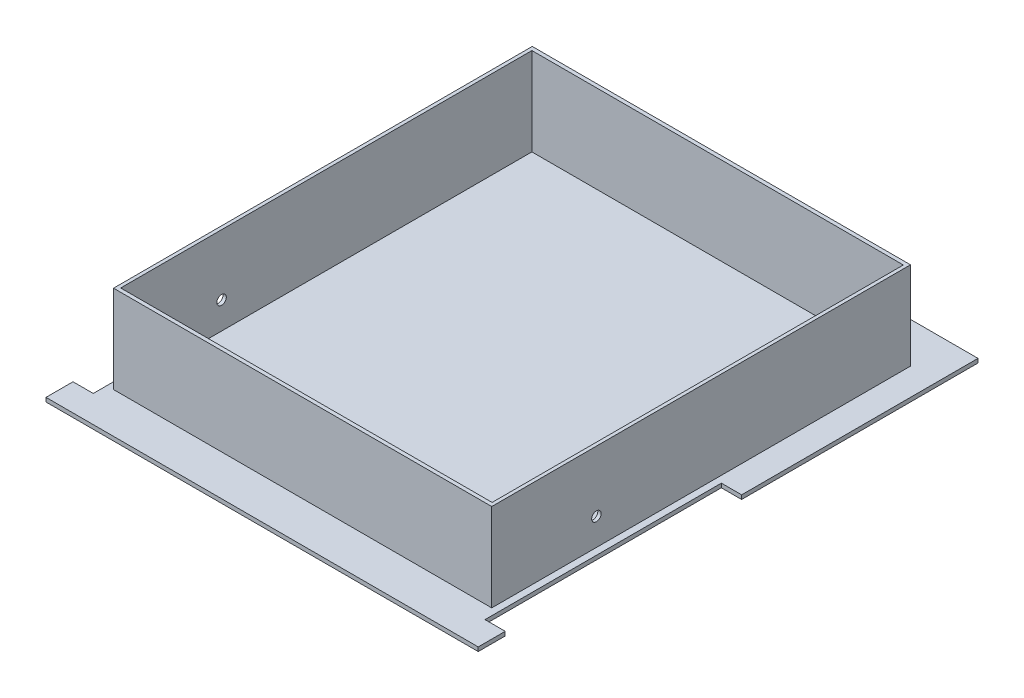
ISO-10303-21;
HEADER;
FILE_DESCRIPTION(('STEP AP214'),'2;1');
FILE_NAME('part.step','',(''),(''),'','','');
FILE_SCHEMA(('AUTOMOTIVE_DESIGN { 1 0 10303 214 1 1 1 1 }'));
ENDSEC;
DATA;
#1=APPLICATION_CONTEXT('core data for automotive mechanical design processes');
#2=APPLICATION_PROTOCOL_DEFINITION('international standard','automotive_design',2000,#1);
#3=PRODUCT_CONTEXT('',#1,'mechanical');
#4=PRODUCT('Part','Part','',(#3));
#5=PRODUCT_RELATED_PRODUCT_CATEGORY('part','',(#4));
#6=PRODUCT_DEFINITION_FORMATION('','',#4);
#7=PRODUCT_DEFINITION_CONTEXT('part definition',#1,'design');
#8=PRODUCT_DEFINITION('design','',#6,#7);
#9=PRODUCT_DEFINITION_SHAPE('','',#8);
#10=(LENGTH_UNIT() NAMED_UNIT(*) SI_UNIT(.MILLI.,.METRE.));
#11=(NAMED_UNIT(*) PLANE_ANGLE_UNIT() SI_UNIT($,.RADIAN.));
#12=(NAMED_UNIT(*) SI_UNIT($,.STERADIAN.) SOLID_ANGLE_UNIT());
#13=UNCERTAINTY_MEASURE_WITH_UNIT(LENGTH_MEASURE(1.E-05),#10,'distance_accuracy_value','');
#14=(GEOMETRIC_REPRESENTATION_CONTEXT(3) GLOBAL_UNCERTAINTY_ASSIGNED_CONTEXT((#13)) GLOBAL_UNIT_ASSIGNED_CONTEXT((#10,
#11,#12)) REPRESENTATION_CONTEXT('',''));
#15=CARTESIAN_POINT('',(0.,0.,0.));
#16=DIRECTION('',(0.,0.,1.));
#17=DIRECTION('',(1.,0.,0.));
#18=AXIS2_PLACEMENT_3D('',#15,#16,#17);
#19=CARTESIAN_POINT('',(0.,3.,0.));
#20=DIRECTION('',(0.,1.,0.));
#21=DIRECTION('',(0.,0.,1.));
#22=AXIS2_PLACEMENT_3D('',#19,#20,#21);
#23=PLANE('',#22);
#24=DIRECTION('',(-1.,0.,0.));
#25=VECTOR('',#24,1.);
#26=CARTESIAN_POINT('',(-140.,3.,-155.));
#27=LINE('',#26,#25);
#28=CARTESIAN_POINT('',(140.,3.,-155.));
#29=VERTEX_POINT('',#28);
#30=CARTESIAN_POINT('',(-140.,3.,-155.));
#31=VERTEX_POINT('',#30);
#32=EDGE_CURVE('E439',#29,#31,#27,.T.);
#33=ORIENTED_EDGE('',*,*,#32,.F.);
#34=DIRECTION('',(0.,0.,-1.));
#35=VECTOR('',#34,1.);
#36=CARTESIAN_POINT('',(140.,3.,-155.));
#37=LINE('',#36,#35);
#38=CARTESIAN_POINT('',(140.,3.,155.));
#39=VERTEX_POINT('',#38);
#40=EDGE_CURVE('E420',#39,#29,#37,.T.);
#41=ORIENTED_EDGE('',*,*,#40,.F.);
#42=DIRECTION('',(1.,0.,0.));
#43=VECTOR('',#42,1.);
#44=CARTESIAN_POINT('',(-140.,3.,155.));
#45=LINE('',#44,#43);
#46=CARTESIAN_POINT('',(-140.,3.,155.));
#47=VERTEX_POINT('',#46);
#48=EDGE_CURVE('E426',#47,#39,#45,.T.);
#49=ORIENTED_EDGE('',*,*,#48,.F.);
#50=DIRECTION('',(0.,0.,1.));
#51=VECTOR('',#50,1.);
#52=CARTESIAN_POINT('',(-140.,3.,-155.));
#53=LINE('',#52,#51);
#54=EDGE_CURVE('E442',#31,#47,#53,.T.);
#55=ORIENTED_EDGE('',*,*,#54,.F.);
#56=EDGE_LOOP('',(#33,#41,#49,#55));
#57=FACE_BOUND('',#56,.T.);
#58=DIRECTION('',(0.,0.,-1.));
#59=VECTOR('',#58,1.);
#60=CARTESIAN_POINT('',(160.,3.,-185.));
#61=LINE('',#60,#59);
#62=CARTESIAN_POINT('',(160.,3.,185.));
#63=VERTEX_POINT('',#62);
#64=CARTESIAN_POINT('',(160.,3.,165.));
#65=VERTEX_POINT('',#64);
#66=EDGE_CURVE('E462',#63,#65,#61,.T.);
#67=ORIENTED_EDGE('',*,*,#66,.T.);
#68=DIRECTION('',(-1.,0.,0.));
#69=VECTOR('',#68,1.);
#70=CARTESIAN_POINT('',(145.,3.,165.));
#71=LINE('',#70,#69);
#72=CARTESIAN_POINT('',(145.,3.,165.));
#73=VERTEX_POINT('',#72);
#74=EDGE_CURVE('E330',#65,#73,#71,.T.);
#75=ORIENTED_EDGE('',*,*,#74,.T.);
#76=DIRECTION('',(0.,0.,-1.));
#77=VECTOR('',#76,1.);
#78=CARTESIAN_POINT('',(145.,3.,-10.));
#79=LINE('',#78,#77);
#80=CARTESIAN_POINT('',(145.,3.,-10.));
#81=VERTEX_POINT('',#80);
#82=EDGE_CURVE('E338',#73,#81,#79,.T.);
#83=ORIENTED_EDGE('',*,*,#82,.T.);
#84=DIRECTION('',(1.,0.,0.));
#85=VECTOR('',#84,1.);
#86=CARTESIAN_POINT('',(160.,3.,-10.));
#87=LINE('',#86,#85);
#88=CARTESIAN_POINT('',(160.,3.,-10.));
#89=VERTEX_POINT('',#88);
#90=EDGE_CURVE('E334',#81,#89,#87,.T.);
#91=ORIENTED_EDGE('',*,*,#90,.T.);
#92=CARTESIAN_POINT('',(160.,3.,-185.));
#93=VERTEX_POINT('',#92);
#94=EDGE_CURVE('E467',#89,#93,#61,.T.);
#95=ORIENTED_EDGE('',*,*,#94,.T.);
#96=DIRECTION('',(-1.,0.,0.));
#97=VECTOR('',#96,1.);
#98=CARTESIAN_POINT('',(-160.,3.,-185.));
#99=LINE('',#98,#97);
#100=CARTESIAN_POINT('',(-160.,3.,-185.));
#101=VERTEX_POINT('',#100);
#102=EDGE_CURVE('E466',#93,#101,#99,.T.);
#103=ORIENTED_EDGE('',*,*,#102,.T.);
#104=DIRECTION('',(0.,0.,1.));
#105=VECTOR('',#104,1.);
#106=CARTESIAN_POINT('',(-160.,3.,-185.));
#107=LINE('',#106,#105);
#108=CARTESIAN_POINT('',(-160.,3.,-10.));
#109=VERTEX_POINT('',#108);
#110=EDGE_CURVE('E471',#101,#109,#107,.T.);
#111=ORIENTED_EDGE('',*,*,#110,.T.);
#112=DIRECTION('',(-1.,0.,0.));
#113=VECTOR('',#112,1.);
#114=CARTESIAN_POINT('',(-160.,3.,-10.));
#115=LINE('',#114,#113);
#116=CARTESIAN_POINT('',(-145.,3.,-10.));
#117=VERTEX_POINT('',#116);
#118=EDGE_CURVE('E363',#117,#109,#115,.T.);
#119=ORIENTED_EDGE('',*,*,#118,.F.);
#120=DIRECTION('',(0.,0.,-1.));
#121=VECTOR('',#120,1.);
#122=CARTESIAN_POINT('',(-145.,3.,-10.));
#123=LINE('',#122,#121);
#124=CARTESIAN_POINT('',(-145.,3.,165.));
#125=VERTEX_POINT('',#124);
#126=EDGE_CURVE('E359',#125,#117,#123,.T.);
#127=ORIENTED_EDGE('',*,*,#126,.F.);
#128=DIRECTION('',(1.,0.,0.));
#129=VECTOR('',#128,1.);
#130=CARTESIAN_POINT('',(-145.,3.,165.));
#131=LINE('',#130,#129);
#132=CARTESIAN_POINT('',(-160.,3.,165.));
#133=VERTEX_POINT('',#132);
#134=EDGE_CURVE('E346',#133,#125,#131,.T.);
#135=ORIENTED_EDGE('',*,*,#134,.F.);
#136=CARTESIAN_POINT('',(-160.,3.,185.));
#137=VERTEX_POINT('',#136);
#138=EDGE_CURVE('E470',#133,#137,#107,.T.);
#139=ORIENTED_EDGE('',*,*,#138,.T.);
#140=DIRECTION('',(1.,0.,0.));
#141=VECTOR('',#140,1.);
#142=CARTESIAN_POINT('',(-160.,3.,185.));
#143=LINE('',#142,#141);
#144=EDGE_CURVE('E475',#137,#63,#143,.T.);
#145=ORIENTED_EDGE('',*,*,#144,.T.);
#146=EDGE_LOOP('',(#67,#75,#83,#91,#95,#103,#111,#119,#127,#135,#139,#145));
#147=FACE_BOUND('',#146,.T.);
#148=ADVANCED_FACE('F40',(#57,#147),#23,.T.);
#149=CARTESIAN_POINT('',(160.,3.,-185.));
#150=DIRECTION('',(-1.,0.,0.));
#151=DIRECTION('',(0.,0.,1.));
#152=AXIS2_PLACEMENT_3D('',#149,#150,#151);
#153=PLANE('',#152);
#154=DIRECTION('',(0.,1.,0.));
#155=VECTOR('',#154,1.);
#156=CARTESIAN_POINT('',(160.,-37.,165.));
#157=LINE('',#156,#155);
#158=CARTESIAN_POINT('',(160.,0.,165.));
#159=VERTEX_POINT('',#158);
#160=EDGE_CURVE('E342',#159,#65,#157,.T.);
#161=ORIENTED_EDGE('',*,*,#160,.T.);
#162=ORIENTED_EDGE('',*,*,#66,.F.);
#163=DIRECTION('',(0.,-1.,0.));
#164=VECTOR('',#163,1.);
#165=CARTESIAN_POINT('',(160.,3.,185.));
#166=LINE('',#165,#164);
#167=CARTESIAN_POINT('',(160.,0.,185.));
#168=VERTEX_POINT('',#167);
#169=EDGE_CURVE('E478',#63,#168,#166,.T.);
#170=ORIENTED_EDGE('',*,*,#169,.T.);
#171=DIRECTION('',(0.,0.,-1.));
#172=VECTOR('',#171,1.);
#173=CARTESIAN_POINT('',(160.,0.,-185.));
#174=LINE('',#173,#172);
#175=EDGE_CURVE('E479',#168,#159,#174,.T.);
#176=ORIENTED_EDGE('',*,*,#175,.T.);
#177=EDGE_LOOP('',(#161,#162,#170,#176));
#178=FACE_BOUND('',#177,.T.);
#179=ADVANCED_FACE('F42',(#178),#153,.F.);
#180=DIRECTION('',(0.,1.,0.));
#181=VECTOR('',#180,1.);
#182=CARTESIAN_POINT('',(160.,-37.,-10.));
#183=LINE('',#182,#181);
#184=CARTESIAN_POINT('',(160.,0.,-10.));
#185=VERTEX_POINT('',#184);
#186=EDGE_CURVE('E350',#185,#89,#183,.T.);
#187=ORIENTED_EDGE('',*,*,#186,.F.);
#188=CARTESIAN_POINT('',(160.,0.,-185.));
#189=VERTEX_POINT('',#188);
#190=EDGE_CURVE('E461',#185,#189,#174,.T.);
#191=ORIENTED_EDGE('',*,*,#190,.T.);
#192=DIRECTION('',(0.,-1.,0.));
#193=VECTOR('',#192,1.);
#194=CARTESIAN_POINT('',(160.,3.,-185.));
#195=LINE('',#194,#193);
#196=EDGE_CURVE('E505',#93,#189,#195,.T.);
#197=ORIENTED_EDGE('',*,*,#196,.F.);
#198=ORIENTED_EDGE('',*,*,#94,.F.);
#199=EDGE_LOOP('',(#187,#191,#197,#198));
#200=FACE_BOUND('',#199,.T.);
#201=ADVANCED_FACE('F543',(#200),#153,.F.);
#202=CARTESIAN_POINT('',(0.,0.,0.));
#203=DIRECTION('',(0.,1.,0.));
#204=DIRECTION('',(0.,0.,1.));
#205=AXIS2_PLACEMENT_3D('',#202,#203,#204);
#206=PLANE('',#205);
#207=DIRECTION('',(1.,0.,0.));
#208=VECTOR('',#207,1.);
#209=CARTESIAN_POINT('',(-100.,0.,-135.));
#210=LINE('',#209,#208);
#211=CARTESIAN_POINT('',(-100.,0.,-135.));
#212=VERTEX_POINT('',#211);
#213=CARTESIAN_POINT('',(-62.,0.,-135.));
#214=VERTEX_POINT('',#213);
#215=EDGE_CURVE('E262',#212,#214,#210,.T.);
#216=ORIENTED_EDGE('',*,*,#215,.F.);
#217=DIRECTION('',(0.,0.,-1.));
#218=VECTOR('',#217,1.);
#219=CARTESIAN_POINT('',(-100.,0.,-97.));
#220=LINE('',#219,#218);
#221=CARTESIAN_POINT('',(-100.,0.,-97.));
#222=VERTEX_POINT('',#221);
#223=EDGE_CURVE('E57',#222,#212,#220,.T.);
#224=ORIENTED_EDGE('',*,*,#223,.F.);
#225=DIRECTION('',(-1.,0.,0.));
#226=VECTOR('',#225,1.);
#227=CARTESIAN_POINT('',(-100.,0.,-97.));
#228=LINE('',#227,#226);
#229=CARTESIAN_POINT('',(-62.0000000000001,0.,-97.));
#230=VERTEX_POINT('',#229);
#231=EDGE_CURVE('E249',#230,#222,#228,.T.);
#232=ORIENTED_EDGE('',*,*,#231,.F.);
#233=DIRECTION('',(0.,0.,1.));
#234=VECTOR('',#233,1.);
#235=CARTESIAN_POINT('',(-62.0000000000001,0.,-97.));
#236=LINE('',#235,#234);
#237=EDGE_CURVE('E253',#214,#230,#236,.T.);
#238=ORIENTED_EDGE('',*,*,#237,.F.);
#239=EDGE_LOOP('',(#216,#224,#232,#238));
#240=FACE_BOUND('',#239,.T.);
#241=DIRECTION('',(1.,0.,0.));
#242=VECTOR('',#241,1.);
#243=CARTESIAN_POINT('',(62.0000000000001,0.,-135.));
#244=LINE('',#243,#242);
#245=CARTESIAN_POINT('',(62.0000000000001,0.,-135.));
#246=VERTEX_POINT('',#245);
#247=CARTESIAN_POINT('',(100.,0.,-135.));
#248=VERTEX_POINT('',#247);
#249=EDGE_CURVE('E298',#246,#248,#244,.T.);
#250=ORIENTED_EDGE('',*,*,#249,.F.);
#251=DIRECTION('',(0.,0.,-1.));
#252=VECTOR('',#251,1.);
#253=CARTESIAN_POINT('',(62.0000000000001,0.,-97.));
#254=LINE('',#253,#252);
#255=CARTESIAN_POINT('',(62.0000000000001,0.,-97.));
#256=VERTEX_POINT('',#255);
#257=EDGE_CURVE('E65',#256,#246,#254,.T.);
#258=ORIENTED_EDGE('',*,*,#257,.F.);
#259=DIRECTION('',(-1.,0.,0.));
#260=VECTOR('',#259,1.);
#261=CARTESIAN_POINT('',(62.0000000000001,0.,-97.));
#262=LINE('',#261,#260);
#263=CARTESIAN_POINT('',(100.,0.,-97.));
#264=VERTEX_POINT('',#263);
#265=EDGE_CURVE('E283',#264,#256,#262,.T.);
#266=ORIENTED_EDGE('',*,*,#265,.F.);
#267=DIRECTION('',(0.,0.,1.));
#268=VECTOR('',#267,1.);
#269=CARTESIAN_POINT('',(100.,0.,-97.));
#270=LINE('',#269,#268);
#271=EDGE_CURVE('E302',#248,#264,#270,.T.);
#272=ORIENTED_EDGE('',*,*,#271,.F.);
#273=EDGE_LOOP('',(#250,#258,#266,#272));
#274=FACE_BOUND('',#273,.T.);
#275=DIRECTION('',(-1.,0.,0.));
#276=VECTOR('',#275,1.);
#277=CARTESIAN_POINT('',(0.,0.,165.));
#278=LINE('',#277,#276);
#279=CARTESIAN_POINT('',(145.,0.,165.));
#280=VERTEX_POINT('',#279);
#281=EDGE_CURVE('E11',#159,#280,#278,.T.);
#282=ORIENTED_EDGE('',*,*,#281,.F.);
#283=ORIENTED_EDGE('',*,*,#175,.F.);
#284=DIRECTION('',(1.,0.,0.));
#285=VECTOR('',#284,1.);
#286=CARTESIAN_POINT('',(-160.,0.,185.));
#287=LINE('',#286,#285);
#288=CARTESIAN_POINT('',(-160.,0.,185.));
#289=VERTEX_POINT('',#288);
#290=EDGE_CURVE('E491',#289,#168,#287,.T.);
#291=ORIENTED_EDGE('',*,*,#290,.F.);
#292=DIRECTION('',(0.,0.,1.));
#293=VECTOR('',#292,1.);
#294=CARTESIAN_POINT('',(-160.,0.,-185.));
#295=LINE('',#294,#293);
#296=CARTESIAN_POINT('',(-160.,0.,165.));
#297=VERTEX_POINT('',#296);
#298=EDGE_CURVE('E486',#297,#289,#295,.T.);
#299=ORIENTED_EDGE('',*,*,#298,.F.);
#300=DIRECTION('',(1.,0.,0.));
#301=VECTOR('',#300,1.);
#302=CARTESIAN_POINT('',(0.,0.,165.));
#303=LINE('',#302,#301);
#304=CARTESIAN_POINT('',(-145.,0.,165.));
#305=VERTEX_POINT('',#304);
#306=EDGE_CURVE('E517',#297,#305,#303,.T.);
#307=ORIENTED_EDGE('',*,*,#306,.T.);
#308=DIRECTION('',(0.,0.,-1.));
#309=VECTOR('',#308,1.);
#310=CARTESIAN_POINT('',(-145.,0.,0.));
#311=LINE('',#310,#309);
#312=CARTESIAN_POINT('',(-145.,0.,-10.));
#313=VERTEX_POINT('',#312);
#314=EDGE_CURVE('E509',#305,#313,#311,.T.);
#315=ORIENTED_EDGE('',*,*,#314,.T.);
#316=DIRECTION('',(-1.,0.,0.));
#317=VECTOR('',#316,1.);
#318=CARTESIAN_POINT('',(0.,0.,-10.));
#319=LINE('',#318,#317);
#320=CARTESIAN_POINT('',(-160.,0.,-10.));
#321=VERTEX_POINT('',#320);
#322=EDGE_CURVE('E513',#313,#321,#319,.T.);
#323=ORIENTED_EDGE('',*,*,#322,.T.);
#324=CARTESIAN_POINT('',(-160.,0.,-185.));
#325=VERTEX_POINT('',#324);
#326=EDGE_CURVE('E487',#325,#321,#295,.T.);
#327=ORIENTED_EDGE('',*,*,#326,.F.);
#328=DIRECTION('',(-1.,0.,0.));
#329=VECTOR('',#328,1.);
#330=CARTESIAN_POINT('',(-160.,0.,-185.));
#331=LINE('',#330,#329);
#332=EDGE_CURVE('E483',#189,#325,#331,.T.);
#333=ORIENTED_EDGE('',*,*,#332,.F.);
#334=ORIENTED_EDGE('',*,*,#190,.F.);
#335=DIRECTION('',(1.,0.,0.));
#336=VECTOR('',#335,1.);
#337=CARTESIAN_POINT('',(0.,0.,-10.));
#338=LINE('',#337,#336);
#339=CARTESIAN_POINT('',(145.,0.,-10.));
#340=VERTEX_POINT('',#339);
#341=EDGE_CURVE('E521',#340,#185,#338,.T.);
#342=ORIENTED_EDGE('',*,*,#341,.F.);
#343=DIRECTION('',(0.,0.,-1.));
#344=VECTOR('',#343,1.);
#345=CARTESIAN_POINT('',(145.,0.,0.));
#346=LINE('',#345,#344);
#347=EDGE_CURVE('E50',#280,#340,#346,.T.);
#348=ORIENTED_EDGE('',*,*,#347,.F.);
#349=EDGE_LOOP('',(#282,#283,#291,#299,#307,#315,#323,#327,#333,#334,#342,#348));
#350=FACE_BOUND('',#349,.T.);
#351=ADVANCED_FACE('F536',(#240,#274,#350),#206,.F.);
#352=CARTESIAN_POINT('',(-160.,3.,-185.));
#353=DIRECTION('',(1.,0.,0.));
#354=DIRECTION('',(0.,0.,-1.));
#355=AXIS2_PLACEMENT_3D('',#352,#353,#354);
#356=PLANE('',#355);
#357=ORIENTED_EDGE('',*,*,#138,.F.);
#358=DIRECTION('',(0.,1.,0.));
#359=VECTOR('',#358,1.);
#360=CARTESIAN_POINT('',(-160.,-37.,165.));
#361=LINE('',#360,#359);
#362=EDGE_CURVE('E367',#297,#133,#361,.T.);
#363=ORIENTED_EDGE('',*,*,#362,.F.);
#364=ORIENTED_EDGE('',*,*,#298,.T.);
#365=DIRECTION('',(0.,-1.,0.));
#366=VECTOR('',#365,1.);
#367=CARTESIAN_POINT('',(-160.,3.,185.));
#368=LINE('',#367,#366);
#369=EDGE_CURVE('E497',#137,#289,#368,.T.);
#370=ORIENTED_EDGE('',*,*,#369,.F.);
#371=EDGE_LOOP('',(#357,#363,#364,#370));
#372=FACE_BOUND('',#371,.T.);
#373=ADVANCED_FACE('F760',(#372),#356,.F.);
#374=CARTESIAN_POINT('',(-160.,3.,-185.));
#375=DIRECTION('',(0.,0.,1.));
#376=DIRECTION('',(1.,0.,0.));
#377=AXIS2_PLACEMENT_3D('',#374,#375,#376);
#378=PLANE('',#377);
#379=ORIENTED_EDGE('',*,*,#332,.T.);
#380=DIRECTION('',(0.,-1.,0.));
#381=VECTOR('',#380,1.);
#382=CARTESIAN_POINT('',(-160.,3.,-185.));
#383=LINE('',#382,#381);
#384=EDGE_CURVE('E501',#101,#325,#383,.T.);
#385=ORIENTED_EDGE('',*,*,#384,.F.);
#386=ORIENTED_EDGE('',*,*,#102,.F.);
#387=ORIENTED_EDGE('',*,*,#196,.T.);
#388=EDGE_LOOP('',(#379,#385,#386,#387));
#389=FACE_BOUND('',#388,.T.);
#390=ADVANCED_FACE('F757',(#389),#378,.F.);
#391=ORIENTED_EDGE('',*,*,#326,.T.);
#392=DIRECTION('',(0.,1.,0.));
#393=VECTOR('',#392,1.);
#394=CARTESIAN_POINT('',(-160.,-37.,-10.));
#395=LINE('',#394,#393);
#396=EDGE_CURVE('E371',#321,#109,#395,.T.);
#397=ORIENTED_EDGE('',*,*,#396,.T.);
#398=ORIENTED_EDGE('',*,*,#110,.F.);
#399=ORIENTED_EDGE('',*,*,#384,.T.);
#400=EDGE_LOOP('',(#391,#397,#398,#399));
#401=FACE_BOUND('',#400,.T.);
#402=ADVANCED_FACE('F751',(#401),#356,.F.);
#403=CARTESIAN_POINT('',(-160.,3.,185.));
#404=DIRECTION('',(0.,0.,-1.));
#405=DIRECTION('',(-1.,0.,0.));
#406=AXIS2_PLACEMENT_3D('',#403,#404,#405);
#407=PLANE('',#406);
#408=ORIENTED_EDGE('',*,*,#290,.T.);
#409=ORIENTED_EDGE('',*,*,#169,.F.);
#410=ORIENTED_EDGE('',*,*,#144,.F.);
#411=ORIENTED_EDGE('',*,*,#369,.T.);
#412=EDGE_LOOP('',(#408,#409,#410,#411));
#413=FACE_BOUND('',#412,.T.);
#414=ADVANCED_FACE('F756',(#413),#407,.F.);
#415=CARTESIAN_POINT('',(0.,68.,0.));
#416=DIRECTION('',(0.,1.,0.));
#417=DIRECTION('',(0.,0.,1.));
#418=AXIS2_PLACEMENT_3D('',#415,#416,#417);
#419=PLANE('',#418);
#420=DIRECTION('',(0.,0.,-1.));
#421=VECTOR('',#420,1.);
#422=CARTESIAN_POINT('',(140.,68.,-155.));
#423=LINE('',#422,#421);
#424=CARTESIAN_POINT('',(140.,68.,155.));
#425=VERTEX_POINT('',#424);
#426=CARTESIAN_POINT('',(140.,68.,-155.));
#427=VERTEX_POINT('',#426);
#428=EDGE_CURVE('E421',#425,#427,#423,.T.);
#429=ORIENTED_EDGE('',*,*,#428,.T.);
#430=DIRECTION('',(-1.,0.,0.));
#431=VECTOR('',#430,1.);
#432=CARTESIAN_POINT('',(-140.,68.,-155.));
#433=LINE('',#432,#431);
#434=CARTESIAN_POINT('',(-140.,68.,-155.));
#435=VERTEX_POINT('',#434);
#436=EDGE_CURVE('E425',#427,#435,#433,.T.);
#437=ORIENTED_EDGE('',*,*,#436,.T.);
#438=DIRECTION('',(0.,0.,1.));
#439=VECTOR('',#438,1.);
#440=CARTESIAN_POINT('',(-140.,68.,-155.));
#441=LINE('',#440,#439);
#442=CARTESIAN_POINT('',(-140.,68.,155.));
#443=VERTEX_POINT('',#442);
#444=EDGE_CURVE('E429',#435,#443,#441,.T.);
#445=ORIENTED_EDGE('',*,*,#444,.T.);
#446=DIRECTION('',(1.,0.,0.));
#447=VECTOR('',#446,1.);
#448=CARTESIAN_POINT('',(-140.,68.,155.));
#449=LINE('',#448,#447);
#450=EDGE_CURVE('E432',#443,#425,#449,.T.);
#451=ORIENTED_EDGE('',*,*,#450,.T.);
#452=EDGE_LOOP('',(#429,#437,#445,#451));
#453=FACE_BOUND('',#452,.T.);
#454=DIRECTION('',(-1.,0.,0.));
#455=VECTOR('',#454,1.);
#456=CARTESIAN_POINT('',(-137.5,68.,-152.232142857143));
#457=LINE('',#456,#455);
#458=CARTESIAN_POINT('',(137.5,68.,-152.232142857143));
#459=VERTEX_POINT('',#458);
#460=CARTESIAN_POINT('',(-137.5,68.,-152.232142857143));
#461=VERTEX_POINT('',#460);
#462=EDGE_CURVE('E383',#459,#461,#457,.T.);
#463=ORIENTED_EDGE('',*,*,#462,.F.);
#464=DIRECTION('',(0.,0.,-1.));
#465=VECTOR('',#464,1.);
#466=CARTESIAN_POINT('',(137.5,68.,-152.232142857143));
#467=LINE('',#466,#465);
#468=CARTESIAN_POINT('',(137.5,68.,152.232142857143));
#469=VERTEX_POINT('',#468);
#470=EDGE_CURVE('E380',#469,#459,#467,.T.);
#471=ORIENTED_EDGE('',*,*,#470,.F.);
#472=DIRECTION('',(1.,0.,0.));
#473=VECTOR('',#472,1.);
#474=CARTESIAN_POINT('',(-137.5,68.,152.232142857143));
#475=LINE('',#474,#473);
#476=CARTESIAN_POINT('',(-137.5,68.,152.232142857143));
#477=VERTEX_POINT('',#476);
#478=EDGE_CURVE('E391',#477,#469,#475,.T.);
#479=ORIENTED_EDGE('',*,*,#478,.F.);
#480=DIRECTION('',(0.,0.,1.));
#481=VECTOR('',#480,1.);
#482=CARTESIAN_POINT('',(-137.5,68.,-152.232142857143));
#483=LINE('',#482,#481);
#484=EDGE_CURVE('E387',#461,#477,#483,.T.);
#485=ORIENTED_EDGE('',*,*,#484,.F.);
#486=EDGE_LOOP('',(#463,#471,#479,#485));
#487=FACE_BOUND('',#486,.T.);
#488=ADVANCED_FACE('F576',(#453,#487),#419,.T.);
#489=CARTESIAN_POINT('',(140.,68.,-155.));
#490=DIRECTION('',(-1.,0.,0.));
#491=DIRECTION('',(0.,0.,1.));
#492=AXIS2_PLACEMENT_3D('',#489,#490,#491);
#493=PLANE('',#492);
#494=CARTESIAN_POINT('',(140.,23.,77.5));
#495=DIRECTION('',(1.,0.,0.));
#496=DIRECTION('',(0.,0.,-1.));
#497=AXIS2_PLACEMENT_3D('',#494,#495,#496);
#498=CIRCLE('',#497,3.50000000000001);
#499=CARTESIAN_POINT('',(140.,23.,74.));
#500=VERTEX_POINT('',#499);
#501=EDGE_CURVE('E272',#500,#500,#498,.T.);
#502=ORIENTED_EDGE('',*,*,#501,.F.);
#503=EDGE_LOOP('',(#502));
#504=FACE_BOUND('',#503,.T.);
#505=ORIENTED_EDGE('',*,*,#40,.T.);
#506=DIRECTION('',(0.,-1.,0.));
#507=VECTOR('',#506,1.);
#508=CARTESIAN_POINT('',(140.,68.,-155.));
#509=LINE('',#508,#507);
#510=EDGE_CURVE('E458',#427,#29,#509,.T.);
#511=ORIENTED_EDGE('',*,*,#510,.F.);
#512=ORIENTED_EDGE('',*,*,#428,.F.);
#513=DIRECTION('',(0.,-1.,0.));
#514=VECTOR('',#513,1.);
#515=CARTESIAN_POINT('',(140.,68.,155.));
#516=LINE('',#515,#514);
#517=EDGE_CURVE('E435',#425,#39,#516,.T.);
#518=ORIENTED_EDGE('',*,*,#517,.T.);
#519=EDGE_LOOP('',(#505,#511,#512,#518));
#520=FACE_BOUND('',#519,.T.);
#521=ADVANCED_FACE('F806',(#504,#520),#493,.F.);
#522=CARTESIAN_POINT('',(-140.,68.,-155.));
#523=DIRECTION('',(0.,0.,1.));
#524=DIRECTION('',(1.,0.,0.));
#525=AXIS2_PLACEMENT_3D('',#522,#523,#524);
#526=PLANE('',#525);
#527=ORIENTED_EDGE('',*,*,#32,.T.);
#528=DIRECTION('',(0.,-1.,0.));
#529=VECTOR('',#528,1.);
#530=CARTESIAN_POINT('',(-140.,68.,-155.));
#531=LINE('',#530,#529);
#532=EDGE_CURVE('E454',#435,#31,#531,.T.);
#533=ORIENTED_EDGE('',*,*,#532,.F.);
#534=ORIENTED_EDGE('',*,*,#436,.F.);
#535=ORIENTED_EDGE('',*,*,#510,.T.);
#536=EDGE_LOOP('',(#527,#533,#534,#535));
#537=FACE_BOUND('',#536,.T.);
#538=ADVANCED_FACE('F801',(#537),#526,.F.);
#539=CARTESIAN_POINT('',(-140.,68.,-155.));
#540=DIRECTION('',(1.,0.,0.));
#541=DIRECTION('',(0.,0.,-1.));
#542=AXIS2_PLACEMENT_3D('',#539,#540,#541);
#543=PLANE('',#542);
#544=CARTESIAN_POINT('',(-140.,23.,77.5));
#545=DIRECTION('',(1.,0.,0.));
#546=DIRECTION('',(0.,0.,-1.));
#547=AXIS2_PLACEMENT_3D('',#544,#545,#546);
#548=CIRCLE('',#547,3.50000000000001);
#549=CARTESIAN_POINT('',(-140.,23.,74.));
#550=VERTEX_POINT('',#549);
#551=EDGE_CURVE('E326',#550,#550,#548,.T.);
#552=ORIENTED_EDGE('',*,*,#551,.T.);
#553=EDGE_LOOP('',(#552));
#554=FACE_BOUND('',#553,.T.);
#555=ORIENTED_EDGE('',*,*,#54,.T.);
#556=DIRECTION('',(0.,-1.,0.));
#557=VECTOR('',#556,1.);
#558=CARTESIAN_POINT('',(-140.,68.,155.));
#559=LINE('',#558,#557);
#560=EDGE_CURVE('E451',#443,#47,#559,.T.);
#561=ORIENTED_EDGE('',*,*,#560,.F.);
#562=ORIENTED_EDGE('',*,*,#444,.F.);
#563=ORIENTED_EDGE('',*,*,#532,.T.);
#564=EDGE_LOOP('',(#555,#561,#562,#563));
#565=FACE_BOUND('',#564,.T.);
#566=ADVANCED_FACE('F592',(#554,#565),#543,.F.);
#567=CARTESIAN_POINT('',(-140.,68.,155.));
#568=DIRECTION('',(0.,0.,-1.));
#569=DIRECTION('',(-1.,0.,0.));
#570=AXIS2_PLACEMENT_3D('',#567,#568,#569);
#571=PLANE('',#570);
#572=ORIENTED_EDGE('',*,*,#48,.T.);
#573=ORIENTED_EDGE('',*,*,#517,.F.);
#574=ORIENTED_EDGE('',*,*,#450,.F.);
#575=ORIENTED_EDGE('',*,*,#560,.T.);
#576=EDGE_LOOP('',(#572,#573,#574,#575));
#577=FACE_BOUND('',#576,.T.);
#578=ADVANCED_FACE('F583',(#577),#571,.F.);
#579=CARTESIAN_POINT('',(137.5,68.,-152.232142857143));
#580=DIRECTION('',(-1.,0.,0.));
#581=DIRECTION('',(0.,0.,1.));
#582=AXIS2_PLACEMENT_3D('',#579,#580,#581);
#583=PLANE('',#582);
#584=CARTESIAN_POINT('',(137.5,23.,77.5));
#585=DIRECTION('',(-1.,0.,0.));
#586=DIRECTION('',(0.,0.,1.));
#587=AXIS2_PLACEMENT_3D('',#584,#585,#586);
#588=CIRCLE('',#587,3.50000000000001);
#589=CARTESIAN_POINT('',(137.5,23.,81.));
#590=VERTEX_POINT('',#589);
#591=EDGE_CURVE('E322',#590,#590,#588,.T.);
#592=ORIENTED_EDGE('',*,*,#591,.F.);
#593=EDGE_LOOP('',(#592));
#594=FACE_BOUND('',#593,.T.);
#595=DIRECTION('',(0.,0.,-1.));
#596=VECTOR('',#595,1.);
#597=CARTESIAN_POINT('',(137.5,3.,-152.232142857143));
#598=LINE('',#597,#596);
#599=CARTESIAN_POINT('',(137.5,3.,152.232142857143));
#600=VERTEX_POINT('',#599);
#601=CARTESIAN_POINT('',(137.5,3.,-152.232142857143));
#602=VERTEX_POINT('',#601);
#603=EDGE_CURVE('E370',#600,#602,#598,.T.);
#604=ORIENTED_EDGE('',*,*,#603,.F.);
#605=DIRECTION('',(0.,-1.,0.));
#606=VECTOR('',#605,1.);
#607=CARTESIAN_POINT('',(137.5,68.,152.232142857143));
#608=LINE('',#607,#606);
#609=EDGE_CURVE('E394',#469,#600,#608,.T.);
#610=ORIENTED_EDGE('',*,*,#609,.F.);
#611=ORIENTED_EDGE('',*,*,#470,.T.);
#612=DIRECTION('',(0.,-1.,0.));
#613=VECTOR('',#612,1.);
#614=CARTESIAN_POINT('',(137.5,68.,-152.232142857143));
#615=LINE('',#614,#613);
#616=EDGE_CURVE('E416',#459,#602,#615,.T.);
#617=ORIENTED_EDGE('',*,*,#616,.T.);
#618=EDGE_LOOP('',(#604,#610,#611,#617));
#619=FACE_BOUND('',#618,.T.);
#620=ADVANCED_FACE('F581',(#594,#619),#583,.T.);
#621=CARTESIAN_POINT('',(-137.5,68.,-152.232142857143));
#622=DIRECTION('',(0.,0.,1.));
#623=DIRECTION('',(1.,0.,0.));
#624=AXIS2_PLACEMENT_3D('',#621,#622,#623);
#625=PLANE('',#624);
#626=DIRECTION('',(-1.,0.,0.));
#627=VECTOR('',#626,1.);
#628=CARTESIAN_POINT('',(-137.5,3.,-152.232142857143));
#629=LINE('',#628,#627);
#630=CARTESIAN_POINT('',(-137.5,3.,-152.232142857143));
#631=VERTEX_POINT('',#630);
#632=EDGE_CURVE('E397',#602,#631,#629,.T.);
#633=ORIENTED_EDGE('',*,*,#632,.F.);
#634=ORIENTED_EDGE('',*,*,#616,.F.);
#635=ORIENTED_EDGE('',*,*,#462,.T.);
#636=DIRECTION('',(0.,-1.,0.));
#637=VECTOR('',#636,1.);
#638=CARTESIAN_POINT('',(-137.5,68.,-152.232142857143));
#639=LINE('',#638,#637);
#640=EDGE_CURVE('E412',#461,#631,#639,.T.);
#641=ORIENTED_EDGE('',*,*,#640,.T.);
#642=EDGE_LOOP('',(#633,#634,#635,#641));
#643=FACE_BOUND('',#642,.T.);
#644=ADVANCED_FACE('F561',(#643),#625,.T.);
#645=CARTESIAN_POINT('',(-137.5,68.,-152.232142857143));
#646=DIRECTION('',(1.,0.,0.));
#647=DIRECTION('',(0.,0.,-1.));
#648=AXIS2_PLACEMENT_3D('',#645,#646,#647);
#649=PLANE('',#648);
#650=CARTESIAN_POINT('',(-137.5,23.,77.5));
#651=DIRECTION('',(1.,0.,0.));
#652=DIRECTION('',(0.,0.,-1.));
#653=AXIS2_PLACEMENT_3D('',#650,#651,#652);
#654=CIRCLE('',#653,3.50000000000001);
#655=CARTESIAN_POINT('',(-137.5,23.,74.));
#656=VERTEX_POINT('',#655);
#657=EDGE_CURVE('E44',#656,#656,#654,.T.);
#658=ORIENTED_EDGE('',*,*,#657,.F.);
#659=EDGE_LOOP('',(#658));
#660=FACE_BOUND('',#659,.T.);
#661=DIRECTION('',(0.,0.,1.));
#662=VECTOR('',#661,1.);
#663=CARTESIAN_POINT('',(-137.5,3.,-152.232142857143));
#664=LINE('',#663,#662);
#665=CARTESIAN_POINT('',(-137.5,3.,152.232142857143));
#666=VERTEX_POINT('',#665);
#667=EDGE_CURVE('E400',#631,#666,#664,.T.);
#668=ORIENTED_EDGE('',*,*,#667,.F.);
#669=ORIENTED_EDGE('',*,*,#640,.F.);
#670=ORIENTED_EDGE('',*,*,#484,.T.);
#671=DIRECTION('',(0.,-1.,0.));
#672=VECTOR('',#671,1.);
#673=CARTESIAN_POINT('',(-137.5,68.,152.232142857143));
#674=LINE('',#673,#672);
#675=EDGE_CURVE('E408',#477,#666,#674,.T.);
#676=ORIENTED_EDGE('',*,*,#675,.T.);
#677=EDGE_LOOP('',(#668,#669,#670,#676));
#678=FACE_BOUND('',#677,.T.);
#679=ADVANCED_FACE('F557',(#660,#678),#649,.T.);
#680=CARTESIAN_POINT('',(-137.5,68.,152.232142857143));
#681=DIRECTION('',(0.,0.,-1.));
#682=DIRECTION('',(-1.,0.,0.));
#683=AXIS2_PLACEMENT_3D('',#680,#681,#682);
#684=PLANE('',#683);
#685=DIRECTION('',(1.,0.,0.));
#686=VECTOR('',#685,1.);
#687=CARTESIAN_POINT('',(-137.5,3.,152.232142857143));
#688=LINE('',#687,#686);
#689=EDGE_CURVE('E384',#666,#600,#688,.T.);
#690=ORIENTED_EDGE('',*,*,#689,.F.);
#691=ORIENTED_EDGE('',*,*,#675,.F.);
#692=ORIENTED_EDGE('',*,*,#478,.T.);
#693=ORIENTED_EDGE('',*,*,#609,.T.);
#694=EDGE_LOOP('',(#690,#691,#692,#693));
#695=FACE_BOUND('',#694,.T.);
#696=ADVANCED_FACE('F560',(#695),#684,.T.);
#697=ORIENTED_EDGE('',*,*,#603,.T.);
#698=ORIENTED_EDGE('',*,*,#632,.T.);
#699=ORIENTED_EDGE('',*,*,#667,.T.);
#700=ORIENTED_EDGE('',*,*,#689,.T.);
#701=EDGE_LOOP('',(#697,#698,#699,#700));
#702=FACE_BOUND('',#701,.T.);
#703=ADVANCED_FACE('F568',(#702),#23,.T.);
#704=CARTESIAN_POINT('',(-145.,-37.,165.));
#705=DIRECTION('',(0.,0.,1.));
#706=DIRECTION('',(1.,0.,0.));
#707=AXIS2_PLACEMENT_3D('',#704,#705,#706);
#708=PLANE('',#707);
#709=ORIENTED_EDGE('',*,*,#362,.T.);
#710=ORIENTED_EDGE('',*,*,#134,.T.);
#711=DIRECTION('',(0.,1.,0.));
#712=VECTOR('',#711,1.);
#713=CARTESIAN_POINT('',(-145.,-37.,165.));
#714=LINE('',#713,#712);
#715=EDGE_CURVE('E366',#305,#125,#714,.T.);
#716=ORIENTED_EDGE('',*,*,#715,.F.);
#717=ORIENTED_EDGE('',*,*,#306,.F.);
#718=EDGE_LOOP('',(#709,#710,#716,#717));
#719=FACE_BOUND('',#718,.T.);
#720=ADVANCED_FACE('F608',(#719),#708,.F.);
#721=CARTESIAN_POINT('',(-160.,-37.,-10.));
#722=DIRECTION('',(0.,0.,-1.));
#723=DIRECTION('',(-1.,0.,0.));
#724=AXIS2_PLACEMENT_3D('',#721,#722,#723);
#725=PLANE('',#724);
#726=DIRECTION('',(0.,1.,0.));
#727=VECTOR('',#726,1.);
#728=CARTESIAN_POINT('',(-145.,-37.,-10.));
#729=LINE('',#728,#727);
#730=EDGE_CURVE('E375',#313,#117,#729,.T.);
#731=ORIENTED_EDGE('',*,*,#730,.T.);
#732=ORIENTED_EDGE('',*,*,#118,.T.);
#733=ORIENTED_EDGE('',*,*,#396,.F.);
#734=ORIENTED_EDGE('',*,*,#322,.F.);
#735=EDGE_LOOP('',(#731,#732,#733,#734));
#736=FACE_BOUND('',#735,.T.);
#737=ADVANCED_FACE('F613',(#736),#725,.F.);
#738=CARTESIAN_POINT('',(-145.,-37.,-10.));
#739=DIRECTION('',(1.,0.,0.));
#740=DIRECTION('',(0.,0.,-1.));
#741=AXIS2_PLACEMENT_3D('',#738,#739,#740);
#742=PLANE('',#741);
#743=ORIENTED_EDGE('',*,*,#715,.T.);
#744=ORIENTED_EDGE('',*,*,#126,.T.);
#745=ORIENTED_EDGE('',*,*,#730,.F.);
#746=ORIENTED_EDGE('',*,*,#314,.F.);
#747=EDGE_LOOP('',(#743,#744,#745,#746));
#748=FACE_BOUND('',#747,.T.);
#749=ADVANCED_FACE('F621',(#748),#742,.F.);
#750=CARTESIAN_POINT('',(145.,-37.,165.));
#751=DIRECTION('',(0.,0.,-1.));
#752=DIRECTION('',(-1.,0.,0.));
#753=AXIS2_PLACEMENT_3D('',#750,#751,#752);
#754=PLANE('',#753);
#755=ORIENTED_EDGE('',*,*,#281,.T.);
#756=DIRECTION('',(0.,1.,0.));
#757=VECTOR('',#756,1.);
#758=CARTESIAN_POINT('',(145.,-37.,165.));
#759=LINE('',#758,#757);
#760=EDGE_CURVE('E343',#280,#73,#759,.T.);
#761=ORIENTED_EDGE('',*,*,#760,.T.);
#762=ORIENTED_EDGE('',*,*,#74,.F.);
#763=ORIENTED_EDGE('',*,*,#160,.F.);
#764=EDGE_LOOP('',(#755,#761,#762,#763));
#765=FACE_BOUND('',#764,.T.);
#766=ADVANCED_FACE('F624',(#765),#754,.T.);
#767=CARTESIAN_POINT('',(145.,-37.,-10.));
#768=DIRECTION('',(1.,0.,0.));
#769=DIRECTION('',(0.,0.,-1.));
#770=AXIS2_PLACEMENT_3D('',#767,#768,#769);
#771=PLANE('',#770);
#772=ORIENTED_EDGE('',*,*,#347,.T.);
#773=DIRECTION('',(0.,1.,0.));
#774=VECTOR('',#773,1.);
#775=CARTESIAN_POINT('',(145.,-37.,-10.));
#776=LINE('',#775,#774);
#777=EDGE_CURVE('E347',#340,#81,#776,.T.);
#778=ORIENTED_EDGE('',*,*,#777,.T.);
#779=ORIENTED_EDGE('',*,*,#82,.F.);
#780=ORIENTED_EDGE('',*,*,#760,.F.);
#781=EDGE_LOOP('',(#772,#778,#779,#780));
#782=FACE_BOUND('',#781,.T.);
#783=ADVANCED_FACE('F530',(#782),#771,.T.);
#784=CARTESIAN_POINT('',(160.,-37.,-10.));
#785=DIRECTION('',(0.,0.,1.));
#786=DIRECTION('',(1.,0.,0.));
#787=AXIS2_PLACEMENT_3D('',#784,#785,#786);
#788=PLANE('',#787);
#789=ORIENTED_EDGE('',*,*,#341,.T.);
#790=ORIENTED_EDGE('',*,*,#186,.T.);
#791=ORIENTED_EDGE('',*,*,#90,.F.);
#792=ORIENTED_EDGE('',*,*,#777,.F.);
#793=EDGE_LOOP('',(#789,#790,#791,#792));
#794=FACE_BOUND('',#793,.T.);
#795=ADVANCED_FACE('F540',(#794),#788,.T.);
#796=CARTESIAN_POINT('',(-160.,23.,77.5));
#797=DIRECTION('',(1.,0.,0.));
#798=DIRECTION('',(0.,0.,-1.));
#799=AXIS2_PLACEMENT_3D('',#796,#797,#798);
#800=CYLINDRICAL_SURFACE('',#799,3.50000000000001);
#801=ORIENTED_EDGE('',*,*,#657,.T.);
#802=EDGE_LOOP('',(#801));
#803=FACE_BOUND('',#802,.T.);
#804=ORIENTED_EDGE('',*,*,#551,.F.);
#805=EDGE_LOOP('',(#804));
#806=FACE_BOUND('',#805,.T.);
#807=ADVANCED_FACE('F554',(#803,#806),#800,.F.);
#808=ORIENTED_EDGE('',*,*,#591,.T.);
#809=EDGE_LOOP('',(#808));
#810=FACE_BOUND('',#809,.T.);
#811=ORIENTED_EDGE('',*,*,#501,.T.);
#812=EDGE_LOOP('',(#811));
#813=FACE_BOUND('',#812,.T.);
#814=ADVANCED_FACE('F638',(#810,#813),#800,.F.);
#815=CARTESIAN_POINT('',(62.0000000000001,2.,-97.));
#816=DIRECTION('',(-1.,0.,0.));
#817=DIRECTION('',(0.,0.,1.));
#818=AXIS2_PLACEMENT_3D('',#815,#816,#817);
#819=PLANE('',#818);
#820=ORIENTED_EDGE('',*,*,#257,.T.);
#821=DIRECTION('',(0.,-1.,0.));
#822=VECTOR('',#821,1.);
#823=CARTESIAN_POINT('',(62.0000000000001,2.,-135.));
#824=LINE('',#823,#822);
#825=CARTESIAN_POINT('',(62.0000000000001,2.,-135.));
#826=VERTEX_POINT('',#825);
#827=EDGE_CURVE('E295',#826,#246,#824,.T.);
#828=ORIENTED_EDGE('',*,*,#827,.F.);
#829=DIRECTION('',(0.,0.,-1.));
#830=VECTOR('',#829,1.);
#831=CARTESIAN_POINT('',(62.0000000000001,2.,-97.));
#832=LINE('',#831,#830);
#833=CARTESIAN_POINT('',(62.0000000000001,2.,-97.));
#834=VERTEX_POINT('',#833);
#835=EDGE_CURVE('E278',#834,#826,#832,.T.);
#836=ORIENTED_EDGE('',*,*,#835,.F.);
#837=DIRECTION('',(0.,-1.,0.));
#838=VECTOR('',#837,1.);
#839=CARTESIAN_POINT('',(62.0000000000001,2.,-97.));
#840=LINE('',#839,#838);
#841=EDGE_CURVE('E263',#834,#256,#840,.T.);
#842=ORIENTED_EDGE('',*,*,#841,.T.);
#843=EDGE_LOOP('',(#820,#828,#836,#842));
#844=FACE_BOUND('',#843,.T.);
#845=ADVANCED_FACE('F639',(#844),#819,.F.);
#846=CARTESIAN_POINT('',(62.0000000000001,2.,-97.));
#847=DIRECTION('',(0.,0.,1.));
#848=DIRECTION('',(1.,0.,0.));
#849=AXIS2_PLACEMENT_3D('',#846,#847,#848);
#850=PLANE('',#849);
#851=ORIENTED_EDGE('',*,*,#265,.T.);
#852=ORIENTED_EDGE('',*,*,#841,.F.);
#853=DIRECTION('',(-1.,0.,0.));
#854=VECTOR('',#853,1.);
#855=CARTESIAN_POINT('',(62.0000000000001,2.,-97.));
#856=LINE('',#855,#854);
#857=CARTESIAN_POINT('',(100.,2.,-97.));
#858=VERTEX_POINT('',#857);
#859=EDGE_CURVE('E291',#858,#834,#856,.T.);
#860=ORIENTED_EDGE('',*,*,#859,.F.);
#861=DIRECTION('',(0.,-1.,0.));
#862=VECTOR('',#861,1.);
#863=CARTESIAN_POINT('',(100.,2.,-97.));
#864=LINE('',#863,#862);
#865=EDGE_CURVE('E311',#858,#264,#864,.T.);
#866=ORIENTED_EDGE('',*,*,#865,.T.);
#867=EDGE_LOOP('',(#851,#852,#860,#866));
#868=FACE_BOUND('',#867,.T.);
#869=ADVANCED_FACE('F642',(#868),#850,.F.);
#870=CARTESIAN_POINT('',(100.,2.,-97.));
#871=DIRECTION('',(1.,0.,0.));
#872=DIRECTION('',(0.,0.,-1.));
#873=AXIS2_PLACEMENT_3D('',#870,#871,#872);
#874=PLANE('',#873);
#875=ORIENTED_EDGE('',*,*,#271,.T.);
#876=ORIENTED_EDGE('',*,*,#865,.F.);
#877=DIRECTION('',(0.,0.,1.));
#878=VECTOR('',#877,1.);
#879=CARTESIAN_POINT('',(100.,2.,-97.));
#880=LINE('',#879,#878);
#881=CARTESIAN_POINT('',(100.,2.,-135.));
#882=VERTEX_POINT('',#881);
#883=EDGE_CURVE('E287',#882,#858,#880,.T.);
#884=ORIENTED_EDGE('',*,*,#883,.F.);
#885=DIRECTION('',(0.,-1.,0.));
#886=VECTOR('',#885,1.);
#887=CARTESIAN_POINT('',(100.,2.,-135.));
#888=LINE('',#887,#886);
#889=EDGE_CURVE('E314',#882,#248,#888,.T.);
#890=ORIENTED_EDGE('',*,*,#889,.T.);
#891=EDGE_LOOP('',(#875,#876,#884,#890));
#892=FACE_BOUND('',#891,.T.);
#893=ADVANCED_FACE('F647',(#892),#874,.F.);
#894=CARTESIAN_POINT('',(62.0000000000001,2.,-135.));
#895=DIRECTION('',(0.,0.,-1.));
#896=DIRECTION('',(-1.,0.,0.));
#897=AXIS2_PLACEMENT_3D('',#894,#895,#896);
#898=PLANE('',#897);
#899=ORIENTED_EDGE('',*,*,#249,.T.);
#900=ORIENTED_EDGE('',*,*,#889,.F.);
#901=DIRECTION('',(1.,0.,0.));
#902=VECTOR('',#901,1.);
#903=CARTESIAN_POINT('',(62.0000000000001,2.,-135.));
#904=LINE('',#903,#902);
#905=EDGE_CURVE('E282',#826,#882,#904,.T.);
#906=ORIENTED_EDGE('',*,*,#905,.F.);
#907=ORIENTED_EDGE('',*,*,#827,.T.);
#908=EDGE_LOOP('',(#899,#900,#906,#907));
#909=FACE_BOUND('',#908,.T.);
#910=ADVANCED_FACE('F643',(#909),#898,.F.);
#911=CARTESIAN_POINT('',(0.,2.,0.));
#912=DIRECTION('',(0.,-1.,0.));
#913=DIRECTION('',(0.,0.,-1.));
#914=AXIS2_PLACEMENT_3D('',#911,#912,#913);
#915=PLANE('',#914);
#916=ORIENTED_EDGE('',*,*,#835,.T.);
#917=ORIENTED_EDGE('',*,*,#905,.T.);
#918=ORIENTED_EDGE('',*,*,#883,.T.);
#919=ORIENTED_EDGE('',*,*,#859,.T.);
#920=EDGE_LOOP('',(#916,#917,#918,#919));
#921=FACE_BOUND('',#920,.T.);
#922=ADVANCED_FACE('F646',(#921),#915,.T.);
#923=CARTESIAN_POINT('',(-100.,2.,-97.));
#924=DIRECTION('',(-1.,0.,0.));
#925=DIRECTION('',(0.,0.,1.));
#926=AXIS2_PLACEMENT_3D('',#923,#924,#925);
#927=PLANE('',#926);
#928=ORIENTED_EDGE('',*,*,#223,.T.);
#929=DIRECTION('',(0.,-1.,0.));
#930=VECTOR('',#929,1.);
#931=CARTESIAN_POINT('',(-100.,2.,-135.));
#932=LINE('',#931,#930);
#933=CARTESIAN_POINT('',(-100.,2.,-135.));
#934=VERTEX_POINT('',#933);
#935=EDGE_CURVE('E224',#934,#212,#932,.T.);
#936=ORIENTED_EDGE('',*,*,#935,.F.);
#937=DIRECTION('',(0.,0.,-1.));
#938=VECTOR('',#937,1.);
#939=CARTESIAN_POINT('',(-100.,2.,-97.));
#940=LINE('',#939,#938);
#941=CARTESIAN_POINT('',(-100.,2.,-97.));
#942=VERTEX_POINT('',#941);
#943=EDGE_CURVE('E228',#942,#934,#940,.T.);
#944=ORIENTED_EDGE('',*,*,#943,.F.);
#945=DIRECTION('',(0.,-1.,0.));
#946=VECTOR('',#945,1.);
#947=CARTESIAN_POINT('',(-100.,2.,-97.));
#948=LINE('',#947,#946);
#949=EDGE_CURVE('E269',#942,#222,#948,.T.);
#950=ORIENTED_EDGE('',*,*,#949,.T.);
#951=EDGE_LOOP('',(#928,#936,#944,#950));
#952=FACE_BOUND('',#951,.T.);
#953=ADVANCED_FACE('F226',(#952),#927,.F.);
#954=CARTESIAN_POINT('',(-100.,2.,-97.));
#955=DIRECTION('',(0.,0.,1.));
#956=DIRECTION('',(1.,0.,0.));
#957=AXIS2_PLACEMENT_3D('',#954,#955,#956);
#958=PLANE('',#957);
#959=ORIENTED_EDGE('',*,*,#231,.T.);
#960=ORIENTED_EDGE('',*,*,#949,.F.);
#961=DIRECTION('',(-1.,0.,0.));
#962=VECTOR('',#961,1.);
#963=CARTESIAN_POINT('',(-100.,2.,-97.));
#964=LINE('',#963,#962);
#965=CARTESIAN_POINT('',(-62.0000000000001,2.,-97.));
#966=VERTEX_POINT('',#965);
#967=EDGE_CURVE('E235',#966,#942,#964,.T.);
#968=ORIENTED_EDGE('',*,*,#967,.F.);
#969=DIRECTION('',(0.,-1.,0.));
#970=VECTOR('',#969,1.);
#971=CARTESIAN_POINT('',(-62.0000000000001,2.,-97.));
#972=LINE('',#971,#970);
#973=EDGE_CURVE('E273',#966,#230,#972,.T.);
#974=ORIENTED_EDGE('',*,*,#973,.T.);
#975=EDGE_LOOP('',(#959,#960,#968,#974));
#976=FACE_BOUND('',#975,.T.);
#977=ADVANCED_FACE('F660',(#976),#958,.F.);
#978=CARTESIAN_POINT('',(-62.0000000000001,2.,-97.));
#979=DIRECTION('',(1.,0.,0.));
#980=DIRECTION('',(0.,0.,-1.));
#981=AXIS2_PLACEMENT_3D('',#978,#979,#980);
#982=PLANE('',#981);
#983=ORIENTED_EDGE('',*,*,#237,.T.);
#984=ORIENTED_EDGE('',*,*,#973,.F.);
#985=DIRECTION('',(0.,0.,1.));
#986=VECTOR('',#985,1.);
#987=CARTESIAN_POINT('',(-62.0000000000001,2.,-97.));
#988=LINE('',#987,#986);
#989=CARTESIAN_POINT('',(-62.,2.,-135.));
#990=VERTEX_POINT('',#989);
#991=EDGE_CURVE('E244',#990,#966,#988,.T.);
#992=ORIENTED_EDGE('',*,*,#991,.F.);
#993=DIRECTION('',(0.,-1.,0.));
#994=VECTOR('',#993,1.);
#995=CARTESIAN_POINT('',(-62.,2.,-135.));
#996=LINE('',#995,#994);
#997=EDGE_CURVE('E234',#990,#214,#996,.T.);
#998=ORIENTED_EDGE('',*,*,#997,.T.);
#999=EDGE_LOOP('',(#983,#984,#992,#998));
#1000=FACE_BOUND('',#999,.T.);
#1001=ADVANCED_FACE('F663',(#1000),#982,.F.);
#1002=CARTESIAN_POINT('',(-100.,2.,-135.));
#1003=DIRECTION('',(0.,0.,-1.));
#1004=DIRECTION('',(-1.,0.,0.));
#1005=AXIS2_PLACEMENT_3D('',#1002,#1003,#1004);
#1006=PLANE('',#1005);
#1007=ORIENTED_EDGE('',*,*,#215,.T.);
#1008=ORIENTED_EDGE('',*,*,#997,.F.);
#1009=DIRECTION('',(1.,0.,0.));
#1010=VECTOR('',#1009,1.);
#1011=CARTESIAN_POINT('',(-100.,2.,-135.));
#1012=LINE('',#1011,#1010);
#1013=EDGE_CURVE('E238',#934,#990,#1012,.T.);
#1014=ORIENTED_EDGE('',*,*,#1013,.F.);
#1015=ORIENTED_EDGE('',*,*,#935,.T.);
#1016=EDGE_LOOP('',(#1007,#1008,#1014,#1015));
#1017=FACE_BOUND('',#1016,.T.);
#1018=ADVANCED_FACE('F239',(#1017),#1006,.F.);
#1019=CARTESIAN_POINT('',(0.,2.,0.));
#1020=DIRECTION('',(0.,-1.,0.));
#1021=DIRECTION('',(0.,0.,-1.));
#1022=AXIS2_PLACEMENT_3D('',#1019,#1020,#1021);
#1023=PLANE('',#1022);
#1024=ORIENTED_EDGE('',*,*,#943,.T.);
#1025=ORIENTED_EDGE('',*,*,#1013,.T.);
#1026=ORIENTED_EDGE('',*,*,#991,.T.);
#1027=ORIENTED_EDGE('',*,*,#967,.T.);
#1028=EDGE_LOOP('',(#1024,#1025,#1026,#1027));
#1029=FACE_BOUND('',#1028,.T.);
#1030=ADVANCED_FACE('F246',(#1029),#1023,.T.);
#1031=CLOSED_SHELL('',(#148,#179,#201,#351,#373,#390,#402,#414,#488,#521,#538,#566,#578,#620,
#644,#679,#696,#703,#720,#737,#749,#766,#783,#795,#807,#814,#845,#869,#893,#910,#922,#953,#977,
#1001,#1018,#1030));
#1032=MANIFOLD_SOLID_BREP('B2',#1031);
#1033=ADVANCED_BREP_SHAPE_REPRESENTATION('',(#18,#1032),#14);
#1034=SHAPE_DEFINITION_REPRESENTATION(#9,#1033);
ENDSEC;
END-ISO-10303-21;
